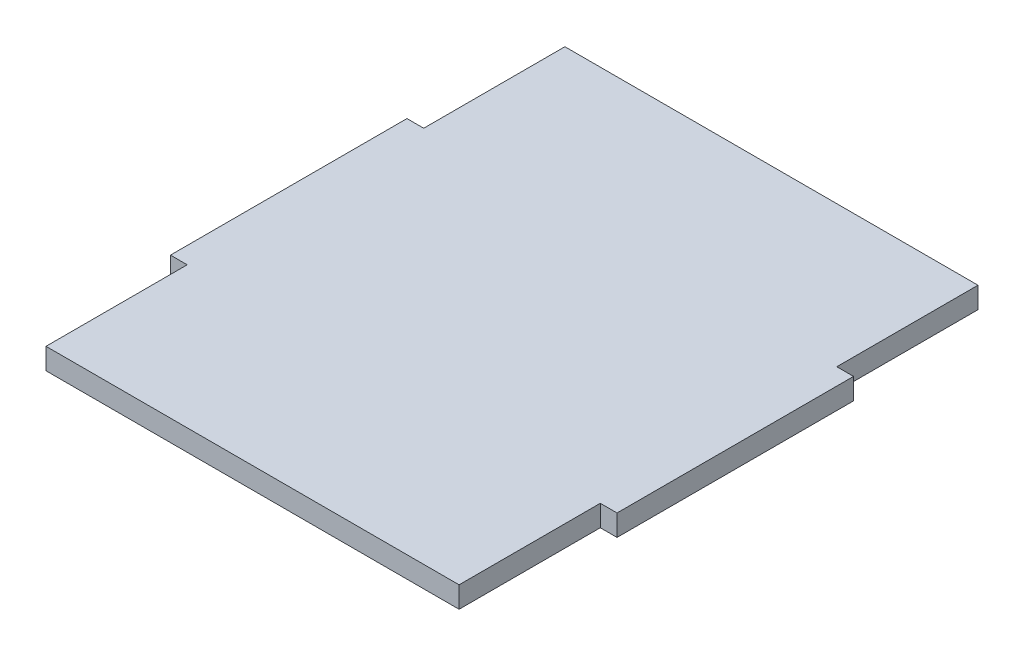
ISO-10303-21;
HEADER;
FILE_DESCRIPTION(('STEP AP214'),'2;1');
FILE_NAME('part.step','',(''),(''),'','','');
FILE_SCHEMA(('AUTOMOTIVE_DESIGN { 1 0 10303 214 1 1 1 1 }'));
ENDSEC;
DATA;
#1=APPLICATION_CONTEXT('core data for automotive mechanical design processes');
#2=APPLICATION_PROTOCOL_DEFINITION('international standard','automotive_design',2000,#1);
#3=PRODUCT_CONTEXT('',#1,'mechanical');
#4=PRODUCT('Part','Part','',(#3));
#5=PRODUCT_RELATED_PRODUCT_CATEGORY('part','',(#4));
#6=PRODUCT_DEFINITION_FORMATION('','',#4);
#7=PRODUCT_DEFINITION_CONTEXT('part definition',#1,'design');
#8=PRODUCT_DEFINITION('design','',#6,#7);
#9=PRODUCT_DEFINITION_SHAPE('','',#8);
#10=(LENGTH_UNIT() NAMED_UNIT(*) SI_UNIT(.MILLI.,.METRE.));
#11=(NAMED_UNIT(*) PLANE_ANGLE_UNIT() SI_UNIT($,.RADIAN.));
#12=(NAMED_UNIT(*) SI_UNIT($,.STERADIAN.) SOLID_ANGLE_UNIT());
#13=UNCERTAINTY_MEASURE_WITH_UNIT(LENGTH_MEASURE(1.E-05),#10,'distance_accuracy_value','');
#14=(GEOMETRIC_REPRESENTATION_CONTEXT(3) GLOBAL_UNCERTAINTY_ASSIGNED_CONTEXT((#13)) GLOBAL_UNIT_ASSIGNED_CONTEXT((#10,
#11,#12)) REPRESENTATION_CONTEXT('',''));
#15=CARTESIAN_POINT('',(0.,0.,0.));
#16=DIRECTION('',(0.,0.,1.));
#17=DIRECTION('',(1.,0.,0.));
#18=AXIS2_PLACEMENT_3D('',#15,#16,#17);
#19=CARTESIAN_POINT('',(79.5179197438117,19.,-184.536114649681));
#20=DIRECTION('',(0.,0.,1.));
#21=DIRECTION('',(1.,0.,0.));
#22=AXIS2_PLACEMENT_3D('',#19,#20,#21);
#23=PLANE('',#22);
#24=DIRECTION('',(-1.,0.,0.));
#25=VECTOR('',#24,1.);
#26=CARTESIAN_POINT('',(79.5179197438117,0.,-184.536114649681));
#27=LINE('',#26,#25);
#28=CARTESIAN_POINT('',(79.5179197438117,0.,-184.536114649681));
#29=VERTEX_POINT('',#28);
#30=CARTESIAN_POINT('',(-290.482080256188,0.,-184.536114649681));
#31=VERTEX_POINT('',#30);
#32=EDGE_CURVE('E153',#29,#31,#27,.T.);
#33=ORIENTED_EDGE('',*,*,#32,.T.);
#34=DIRECTION('',(0.,-1.,0.));
#35=VECTOR('',#34,1.);
#36=CARTESIAN_POINT('',(-290.482080256188,19.,-184.536114649681));
#37=LINE('',#36,#35);
#38=CARTESIAN_POINT('',(-290.482080256188,19.,-184.536114649681));
#39=VERTEX_POINT('',#38);
#40=EDGE_CURVE('E11',#39,#31,#37,.T.);
#41=ORIENTED_EDGE('',*,*,#40,.F.);
#42=DIRECTION('',(-1.,0.,0.));
#43=VECTOR('',#42,1.);
#44=CARTESIAN_POINT('',(79.5179197438117,19.,-184.536114649681));
#45=LINE('',#44,#43);
#46=CARTESIAN_POINT('',(79.5179197438117,19.,-184.536114649681));
#47=VERTEX_POINT('',#46);
#48=EDGE_CURVE('E175',#47,#39,#45,.T.);
#49=ORIENTED_EDGE('',*,*,#48,.F.);
#50=DIRECTION('',(0.,-1.,0.));
#51=VECTOR('',#50,1.);
#52=CARTESIAN_POINT('',(79.5179197438117,19.,-184.536114649681));
#53=LINE('',#52,#51);
#54=EDGE_CURVE('E149',#47,#29,#53,.T.);
#55=ORIENTED_EDGE('',*,*,#54,.T.);
#56=EDGE_LOOP('',(#33,#41,#49,#55));
#57=FACE_BOUND('',#56,.T.);
#58=ADVANCED_FACE('F33',(#57),#23,.F.);
#59=CARTESIAN_POINT('',(-290.482080256188,19.,-184.536114649681));
#60=DIRECTION('',(1.,0.,0.));
#61=DIRECTION('',(0.,0.,-1.));
#62=AXIS2_PLACEMENT_3D('',#59,#60,#61);
#63=PLANE('',#62);
#64=DIRECTION('',(0.,0.,1.));
#65=VECTOR('',#64,1.);
#66=CARTESIAN_POINT('',(-290.482080256188,0.,-184.536114649681));
#67=LINE('',#66,#65);
#68=CARTESIAN_POINT('',(-290.482080256188,0.,-58.0661146496812));
#69=VERTEX_POINT('',#68);
#70=EDGE_CURVE('E156',#31,#69,#67,.T.);
#71=ORIENTED_EDGE('',*,*,#70,.T.);
#72=DIRECTION('',(0.,-1.,0.));
#73=VECTOR('',#72,1.);
#74=CARTESIAN_POINT('',(-290.482080256188,19.,-58.0661146496812));
#75=LINE('',#74,#73);
#76=CARTESIAN_POINT('',(-290.482080256188,19.,-58.0661146496812));
#77=VERTEX_POINT('',#76);
#78=EDGE_CURVE('E41',#77,#69,#75,.T.);
#79=ORIENTED_EDGE('',*,*,#78,.F.);
#80=DIRECTION('',(0.,0.,1.));
#81=VECTOR('',#80,1.);
#82=CARTESIAN_POINT('',(-290.482080256188,19.,-184.536114649681));
#83=LINE('',#82,#81);
#84=EDGE_CURVE('E104',#39,#77,#83,.T.);
#85=ORIENTED_EDGE('',*,*,#84,.F.);
#86=ORIENTED_EDGE('',*,*,#40,.T.);
#87=EDGE_LOOP('',(#71,#79,#85,#86));
#88=FACE_BOUND('',#87,.T.);
#89=ADVANCED_FACE('F253',(#88),#63,.F.);
#90=CARTESIAN_POINT('',(-290.482080256188,19.,-58.0661146496812));
#91=DIRECTION('',(0.,0.,1.));
#92=DIRECTION('',(1.,0.,0.));
#93=AXIS2_PLACEMENT_3D('',#90,#91,#92);
#94=PLANE('',#93);
#95=DIRECTION('',(-1.,0.,0.));
#96=VECTOR('',#95,1.);
#97=CARTESIAN_POINT('',(-290.482080256188,0.,-58.0661146496812));
#98=LINE('',#97,#96);
#99=CARTESIAN_POINT('',(-305.482080256188,0.,-58.0661146496812));
#100=VERTEX_POINT('',#99);
#101=EDGE_CURVE('E158',#69,#100,#98,.T.);
#102=ORIENTED_EDGE('',*,*,#101,.T.);
#103=DIRECTION('',(0.,-1.,0.));
#104=VECTOR('',#103,1.);
#105=CARTESIAN_POINT('',(-305.482080256188,19.,-58.0661146496812));
#106=LINE('',#105,#104);
#107=CARTESIAN_POINT('',(-305.482080256188,19.,-58.0661146496812));
#108=VERTEX_POINT('',#107);
#109=EDGE_CURVE('E194',#108,#100,#106,.T.);
#110=ORIENTED_EDGE('',*,*,#109,.F.);
#111=DIRECTION('',(-1.,0.,0.));
#112=VECTOR('',#111,1.);
#113=CARTESIAN_POINT('',(-290.482080256188,19.,-58.0661146496812));
#114=LINE('',#113,#112);
#115=EDGE_CURVE('E202',#77,#108,#114,.T.);
#116=ORIENTED_EDGE('',*,*,#115,.F.);
#117=ORIENTED_EDGE('',*,*,#78,.T.);
#118=EDGE_LOOP('',(#102,#110,#116,#117));
#119=FACE_BOUND('',#118,.T.);
#120=ADVANCED_FACE('F200',(#119),#94,.F.);
#121=CARTESIAN_POINT('',(-305.482080256188,19.,-58.0661146496812));
#122=DIRECTION('',(1.,0.,0.));
#123=DIRECTION('',(0.,0.,-1.));
#124=AXIS2_PLACEMENT_3D('',#121,#122,#123);
#125=PLANE('',#124);
#126=DIRECTION('',(0.,0.,1.));
#127=VECTOR('',#126,1.);
#128=CARTESIAN_POINT('',(-305.482080256188,0.,-58.0661146496812));
#129=LINE('',#128,#127);
#130=CARTESIAN_POINT('',(-305.482080256188,0.,153.773885350319));
#131=VERTEX_POINT('',#130);
#132=EDGE_CURVE('E160',#100,#131,#129,.T.);
#133=ORIENTED_EDGE('',*,*,#132,.T.);
#134=DIRECTION('',(0.,-1.,0.));
#135=VECTOR('',#134,1.);
#136=CARTESIAN_POINT('',(-305.482080256188,19.,153.773885350319));
#137=LINE('',#136,#135);
#138=CARTESIAN_POINT('',(-305.482080256188,19.,153.773885350319));
#139=VERTEX_POINT('',#138);
#140=EDGE_CURVE('E191',#139,#131,#137,.T.);
#141=ORIENTED_EDGE('',*,*,#140,.F.);
#142=DIRECTION('',(0.,0.,1.));
#143=VECTOR('',#142,1.);
#144=CARTESIAN_POINT('',(-305.482080256188,19.,-58.0661146496812));
#145=LINE('',#144,#143);
#146=EDGE_CURVE('E220',#108,#139,#145,.T.);
#147=ORIENTED_EDGE('',*,*,#146,.F.);
#148=ORIENTED_EDGE('',*,*,#109,.T.);
#149=EDGE_LOOP('',(#133,#141,#147,#148));
#150=FACE_BOUND('',#149,.T.);
#151=ADVANCED_FACE('F211',(#150),#125,.F.);
#152=CARTESIAN_POINT('',(-305.482080256188,19.,153.773885350319));
#153=DIRECTION('',(0.,0.,-1.));
#154=DIRECTION('',(-1.,0.,0.));
#155=AXIS2_PLACEMENT_3D('',#152,#153,#154);
#156=PLANE('',#155);
#157=DIRECTION('',(1.,0.,0.));
#158=VECTOR('',#157,1.);
#159=CARTESIAN_POINT('',(-305.482080256188,0.,153.773885350319));
#160=LINE('',#159,#158);
#161=CARTESIAN_POINT('',(-290.482080256188,0.,153.773885350319));
#162=VERTEX_POINT('',#161);
#163=EDGE_CURVE('E162',#131,#162,#160,.T.);
#164=ORIENTED_EDGE('',*,*,#163,.T.);
#165=DIRECTION('',(0.,-1.,0.));
#166=VECTOR('',#165,1.);
#167=CARTESIAN_POINT('',(-290.482080256188,19.,153.773885350319));
#168=LINE('',#167,#166);
#169=CARTESIAN_POINT('',(-290.482080256188,19.,153.773885350319));
#170=VERTEX_POINT('',#169);
#171=EDGE_CURVE('E188',#170,#162,#168,.T.);
#172=ORIENTED_EDGE('',*,*,#171,.F.);
#173=DIRECTION('',(1.,0.,0.));
#174=VECTOR('',#173,1.);
#175=CARTESIAN_POINT('',(-305.482080256188,19.,153.773885350319));
#176=LINE('',#175,#174);
#177=EDGE_CURVE('E217',#139,#170,#176,.T.);
#178=ORIENTED_EDGE('',*,*,#177,.F.);
#179=ORIENTED_EDGE('',*,*,#140,.T.);
#180=EDGE_LOOP('',(#164,#172,#178,#179));
#181=FACE_BOUND('',#180,.T.);
#182=ADVANCED_FACE('F215',(#181),#156,.F.);
#183=CARTESIAN_POINT('',(-290.482080256188,19.,153.773885350319));
#184=DIRECTION('',(1.,0.,0.));
#185=DIRECTION('',(0.,0.,-1.));
#186=AXIS2_PLACEMENT_3D('',#183,#184,#185);
#187=PLANE('',#186);
#188=DIRECTION('',(0.,0.,1.));
#189=VECTOR('',#188,1.);
#190=CARTESIAN_POINT('',(-290.482080256188,0.,153.773885350319));
#191=LINE('',#190,#189);
#192=CARTESIAN_POINT('',(-290.482080256188,0.,280.243885350319));
#193=VERTEX_POINT('',#192);
#194=EDGE_CURVE('E164',#162,#193,#191,.T.);
#195=ORIENTED_EDGE('',*,*,#194,.T.);
#196=DIRECTION('',(0.,-1.,0.));
#197=VECTOR('',#196,1.);
#198=CARTESIAN_POINT('',(-290.482080256188,19.,280.243885350319));
#199=LINE('',#198,#197);
#200=CARTESIAN_POINT('',(-290.482080256188,19.,280.243885350319));
#201=VERTEX_POINT('',#200);
#202=EDGE_CURVE('E185',#201,#193,#199,.T.);
#203=ORIENTED_EDGE('',*,*,#202,.F.);
#204=DIRECTION('',(0.,0.,1.));
#205=VECTOR('',#204,1.);
#206=CARTESIAN_POINT('',(-290.482080256188,19.,153.773885350319));
#207=LINE('',#206,#205);
#208=EDGE_CURVE('E219',#170,#201,#207,.T.);
#209=ORIENTED_EDGE('',*,*,#208,.F.);
#210=ORIENTED_EDGE('',*,*,#171,.T.);
#211=EDGE_LOOP('',(#195,#203,#209,#210));
#212=FACE_BOUND('',#211,.T.);
#213=ADVANCED_FACE('F266',(#212),#187,.F.);
#214=CARTESIAN_POINT('',(-290.482080256188,19.,280.243885350319));
#215=DIRECTION('',(0.,0.,-1.));
#216=DIRECTION('',(-1.,0.,0.));
#217=AXIS2_PLACEMENT_3D('',#214,#215,#216);
#218=PLANE('',#217);
#219=DIRECTION('',(1.,0.,0.));
#220=VECTOR('',#219,1.);
#221=CARTESIAN_POINT('',(-290.482080256188,0.,280.243885350319));
#222=LINE('',#221,#220);
#223=CARTESIAN_POINT('',(79.5179197438117,0.,280.243885350319));
#224=VERTEX_POINT('',#223);
#225=EDGE_CURVE('E166',#193,#224,#222,.T.);
#226=ORIENTED_EDGE('',*,*,#225,.T.);
#227=DIRECTION('',(0.,-1.,0.));
#228=VECTOR('',#227,1.);
#229=CARTESIAN_POINT('',(79.5179197438117,19.,280.243885350319));
#230=LINE('',#229,#228);
#231=CARTESIAN_POINT('',(79.5179197438117,19.,280.243885350319));
#232=VERTEX_POINT('',#231);
#233=EDGE_CURVE('E182',#232,#224,#230,.T.);
#234=ORIENTED_EDGE('',*,*,#233,.F.);
#235=DIRECTION('',(1.,0.,0.));
#236=VECTOR('',#235,1.);
#237=CARTESIAN_POINT('',(-290.482080256188,19.,280.243885350319));
#238=LINE('',#237,#236);
#239=EDGE_CURVE('E222',#201,#232,#238,.T.);
#240=ORIENTED_EDGE('',*,*,#239,.F.);
#241=ORIENTED_EDGE('',*,*,#202,.T.);
#242=EDGE_LOOP('',(#226,#234,#240,#241));
#243=FACE_BOUND('',#242,.T.);
#244=ADVANCED_FACE('F269',(#243),#218,.F.);
#245=CARTESIAN_POINT('',(79.5179197438117,19.,153.773885350319));
#246=DIRECTION('',(-1.,0.,0.));
#247=DIRECTION('',(0.,0.,1.));
#248=AXIS2_PLACEMENT_3D('',#245,#246,#247);
#249=PLANE('',#248);
#250=DIRECTION('',(0.,0.,-1.));
#251=VECTOR('',#250,1.);
#252=CARTESIAN_POINT('',(79.5179197438117,0.,153.773885350319));
#253=LINE('',#252,#251);
#254=CARTESIAN_POINT('',(79.5179197438117,0.,153.773885350319));
#255=VERTEX_POINT('',#254);
#256=EDGE_CURVE('E168',#224,#255,#253,.T.);
#257=ORIENTED_EDGE('',*,*,#256,.T.);
#258=DIRECTION('',(0.,-1.,0.));
#259=VECTOR('',#258,1.);
#260=CARTESIAN_POINT('',(79.5179197438117,19.,153.773885350319));
#261=LINE('',#260,#259);
#262=CARTESIAN_POINT('',(79.5179197438117,19.,153.773885350319));
#263=VERTEX_POINT('',#262);
#264=EDGE_CURVE('E179',#263,#255,#261,.T.);
#265=ORIENTED_EDGE('',*,*,#264,.F.);
#266=DIRECTION('',(0.,0.,-1.));
#267=VECTOR('',#266,1.);
#268=CARTESIAN_POINT('',(79.5179197438117,19.,153.773885350319));
#269=LINE('',#268,#267);
#270=EDGE_CURVE('E228',#232,#263,#269,.T.);
#271=ORIENTED_EDGE('',*,*,#270,.F.);
#272=ORIENTED_EDGE('',*,*,#233,.T.);
#273=EDGE_LOOP('',(#257,#265,#271,#272));
#274=FACE_BOUND('',#273,.T.);
#275=ADVANCED_FACE('F234',(#274),#249,.F.);
#276=CARTESIAN_POINT('',(94.5179197438118,19.,153.773885350319));
#277=DIRECTION('',(0.,0.,-1.));
#278=DIRECTION('',(-1.,0.,0.));
#279=AXIS2_PLACEMENT_3D('',#276,#277,#278);
#280=PLANE('',#279);
#281=DIRECTION('',(1.,0.,0.));
#282=VECTOR('',#281,1.);
#283=CARTESIAN_POINT('',(94.5179197438118,0.,153.773885350319));
#284=LINE('',#283,#282);
#285=CARTESIAN_POINT('',(94.5179197438118,0.,153.773885350319));
#286=VERTEX_POINT('',#285);
#287=EDGE_CURVE('E170',#255,#286,#284,.T.);
#288=ORIENTED_EDGE('',*,*,#287,.T.);
#289=DIRECTION('',(0.,-1.,0.));
#290=VECTOR('',#289,1.);
#291=CARTESIAN_POINT('',(94.5179197438118,19.,153.773885350319));
#292=LINE('',#291,#290);
#293=CARTESIAN_POINT('',(94.5179197438118,19.,153.773885350319));
#294=VERTEX_POINT('',#293);
#295=EDGE_CURVE('E144',#294,#286,#292,.T.);
#296=ORIENTED_EDGE('',*,*,#295,.F.);
#297=DIRECTION('',(1.,0.,0.));
#298=VECTOR('',#297,1.);
#299=CARTESIAN_POINT('',(94.5179197438118,19.,153.773885350319));
#300=LINE('',#299,#298);
#301=EDGE_CURVE('E135',#263,#294,#300,.T.);
#302=ORIENTED_EDGE('',*,*,#301,.F.);
#303=ORIENTED_EDGE('',*,*,#264,.T.);
#304=EDGE_LOOP('',(#288,#296,#302,#303));
#305=FACE_BOUND('',#304,.T.);
#306=ADVANCED_FACE('F238',(#305),#280,.F.);
#307=CARTESIAN_POINT('',(94.5179197438117,19.,-58.0661146496812));
#308=DIRECTION('',(-1.,0.,0.));
#309=DIRECTION('',(0.,0.,1.));
#310=AXIS2_PLACEMENT_3D('',#307,#308,#309);
#311=PLANE('',#310);
#312=DIRECTION('',(0.,0.,-1.));
#313=VECTOR('',#312,1.);
#314=CARTESIAN_POINT('',(94.5179197438117,0.,-58.0661146496812));
#315=LINE('',#314,#313);
#316=CARTESIAN_POINT('',(94.5179197438117,0.,-58.0661146496812));
#317=VERTEX_POINT('',#316);
#318=EDGE_CURVE('E143',#286,#317,#315,.T.);
#319=ORIENTED_EDGE('',*,*,#318,.T.);
#320=DIRECTION('',(0.,-1.,0.));
#321=VECTOR('',#320,1.);
#322=CARTESIAN_POINT('',(94.5179197438117,19.,-58.0661146496812));
#323=LINE('',#322,#321);
#324=CARTESIAN_POINT('',(94.5179197438117,19.,-58.0661146496812));
#325=VERTEX_POINT('',#324);
#326=EDGE_CURVE('E140',#325,#317,#323,.T.);
#327=ORIENTED_EDGE('',*,*,#326,.F.);
#328=DIRECTION('',(0.,0.,-1.));
#329=VECTOR('',#328,1.);
#330=CARTESIAN_POINT('',(94.5179197438117,19.,-58.0661146496812));
#331=LINE('',#330,#329);
#332=EDGE_CURVE('E129',#294,#325,#331,.T.);
#333=ORIENTED_EDGE('',*,*,#332,.F.);
#334=ORIENTED_EDGE('',*,*,#295,.T.);
#335=EDGE_LOOP('',(#319,#327,#333,#334));
#336=FACE_BOUND('',#335,.T.);
#337=ADVANCED_FACE('F141',(#336),#311,.F.);
#338=CARTESIAN_POINT('',(79.5179197438117,19.,-58.0661146496812));
#339=DIRECTION('',(0.,0.,1.));
#340=DIRECTION('',(1.,0.,0.));
#341=AXIS2_PLACEMENT_3D('',#338,#339,#340);
#342=PLANE('',#341);
#343=DIRECTION('',(-1.,0.,0.));
#344=VECTOR('',#343,1.);
#345=CARTESIAN_POINT('',(79.5179197438117,0.,-58.0661146496812));
#346=LINE('',#345,#344);
#347=CARTESIAN_POINT('',(79.5179197438117,0.,-58.0661146496812));
#348=VERTEX_POINT('',#347);
#349=EDGE_CURVE('E90',#317,#348,#346,.T.);
#350=ORIENTED_EDGE('',*,*,#349,.T.);
#351=DIRECTION('',(0.,-1.,0.));
#352=VECTOR('',#351,1.);
#353=CARTESIAN_POINT('',(79.5179197438117,19.,-58.0661146496812));
#354=LINE('',#353,#352);
#355=CARTESIAN_POINT('',(79.5179197438117,19.,-58.0661146496812));
#356=VERTEX_POINT('',#355);
#357=EDGE_CURVE('E145',#356,#348,#354,.T.);
#358=ORIENTED_EDGE('',*,*,#357,.F.);
#359=DIRECTION('',(-1.,0.,0.));
#360=VECTOR('',#359,1.);
#361=CARTESIAN_POINT('',(79.5179197438117,19.,-58.0661146496812));
#362=LINE('',#361,#360);
#363=EDGE_CURVE('E133',#325,#356,#362,.T.);
#364=ORIENTED_EDGE('',*,*,#363,.F.);
#365=ORIENTED_EDGE('',*,*,#326,.T.);
#366=EDGE_LOOP('',(#350,#358,#364,#365));
#367=FACE_BOUND('',#366,.T.);
#368=ADVANCED_FACE('F147',(#367),#342,.F.);
#369=CARTESIAN_POINT('',(79.5179197438117,19.,-184.536114649681));
#370=DIRECTION('',(-1.,0.,0.));
#371=DIRECTION('',(0.,0.,1.));
#372=AXIS2_PLACEMENT_3D('',#369,#370,#371);
#373=PLANE('',#372);
#374=DIRECTION('',(0.,0.,-1.));
#375=VECTOR('',#374,1.);
#376=CARTESIAN_POINT('',(79.5179197438117,0.,-184.536114649681));
#377=LINE('',#376,#375);
#378=EDGE_CURVE('E96',#348,#29,#377,.T.);
#379=ORIENTED_EDGE('',*,*,#378,.T.);
#380=ORIENTED_EDGE('',*,*,#54,.F.);
#381=DIRECTION('',(0.,0.,-1.));
#382=VECTOR('',#381,1.);
#383=CARTESIAN_POINT('',(79.5179197438117,19.,-184.536114649681));
#384=LINE('',#383,#382);
#385=EDGE_CURVE('E49',#356,#47,#384,.T.);
#386=ORIENTED_EDGE('',*,*,#385,.F.);
#387=ORIENTED_EDGE('',*,*,#357,.T.);
#388=EDGE_LOOP('',(#379,#380,#386,#387));
#389=FACE_BOUND('',#388,.T.);
#390=ADVANCED_FACE('F242',(#389),#373,.F.);
#391=CARTESIAN_POINT('',(0.,19.,0.));
#392=DIRECTION('',(0.,1.,0.));
#393=DIRECTION('',(0.,0.,1.));
#394=AXIS2_PLACEMENT_3D('',#391,#392,#393);
#395=PLANE('',#394);
#396=ORIENTED_EDGE('',*,*,#48,.T.);
#397=ORIENTED_EDGE('',*,*,#84,.T.);
#398=ORIENTED_EDGE('',*,*,#115,.T.);
#399=ORIENTED_EDGE('',*,*,#146,.T.);
#400=ORIENTED_EDGE('',*,*,#177,.T.);
#401=ORIENTED_EDGE('',*,*,#208,.T.);
#402=ORIENTED_EDGE('',*,*,#239,.T.);
#403=ORIENTED_EDGE('',*,*,#270,.T.);
#404=ORIENTED_EDGE('',*,*,#301,.T.);
#405=ORIENTED_EDGE('',*,*,#332,.T.);
#406=ORIENTED_EDGE('',*,*,#363,.T.);
#407=ORIENTED_EDGE('',*,*,#385,.T.);
#408=EDGE_LOOP('',(#396,#397,#398,#399,#400,#401,#402,#403,#404,#405,#406,#407));
#409=FACE_BOUND('',#408,.T.);
#410=ADVANCED_FACE('F131',(#409),#395,.T.);
#411=CARTESIAN_POINT('',(0.,0.,0.));
#412=DIRECTION('',(0.,1.,0.));
#413=DIRECTION('',(0.,0.,1.));
#414=AXIS2_PLACEMENT_3D('',#411,#412,#413);
#415=PLANE('',#414);
#416=ORIENTED_EDGE('',*,*,#32,.F.);
#417=ORIENTED_EDGE('',*,*,#378,.F.);
#418=ORIENTED_EDGE('',*,*,#349,.F.);
#419=ORIENTED_EDGE('',*,*,#318,.F.);
#420=ORIENTED_EDGE('',*,*,#287,.F.);
#421=ORIENTED_EDGE('',*,*,#256,.F.);
#422=ORIENTED_EDGE('',*,*,#225,.F.);
#423=ORIENTED_EDGE('',*,*,#194,.F.);
#424=ORIENTED_EDGE('',*,*,#163,.F.);
#425=ORIENTED_EDGE('',*,*,#132,.F.);
#426=ORIENTED_EDGE('',*,*,#101,.F.);
#427=ORIENTED_EDGE('',*,*,#70,.F.);
#428=EDGE_LOOP('',(#416,#417,#418,#419,#420,#421,#422,#423,#424,#425,#426,#427));
#429=FACE_BOUND('',#428,.T.);
#430=ADVANCED_FACE('F206',(#429),#415,.F.);
#431=CLOSED_SHELL('',(#58,#89,#120,#151,#182,#213,#244,#275,#306,#337,#368,#390,#410,#430));
#432=MANIFOLD_SOLID_BREP('B2',#431);
#433=ADVANCED_BREP_SHAPE_REPRESENTATION('',(#18,#432),#14);
#434=SHAPE_DEFINITION_REPRESENTATION(#9,#433);
ENDSEC;
END-ISO-10303-21;
